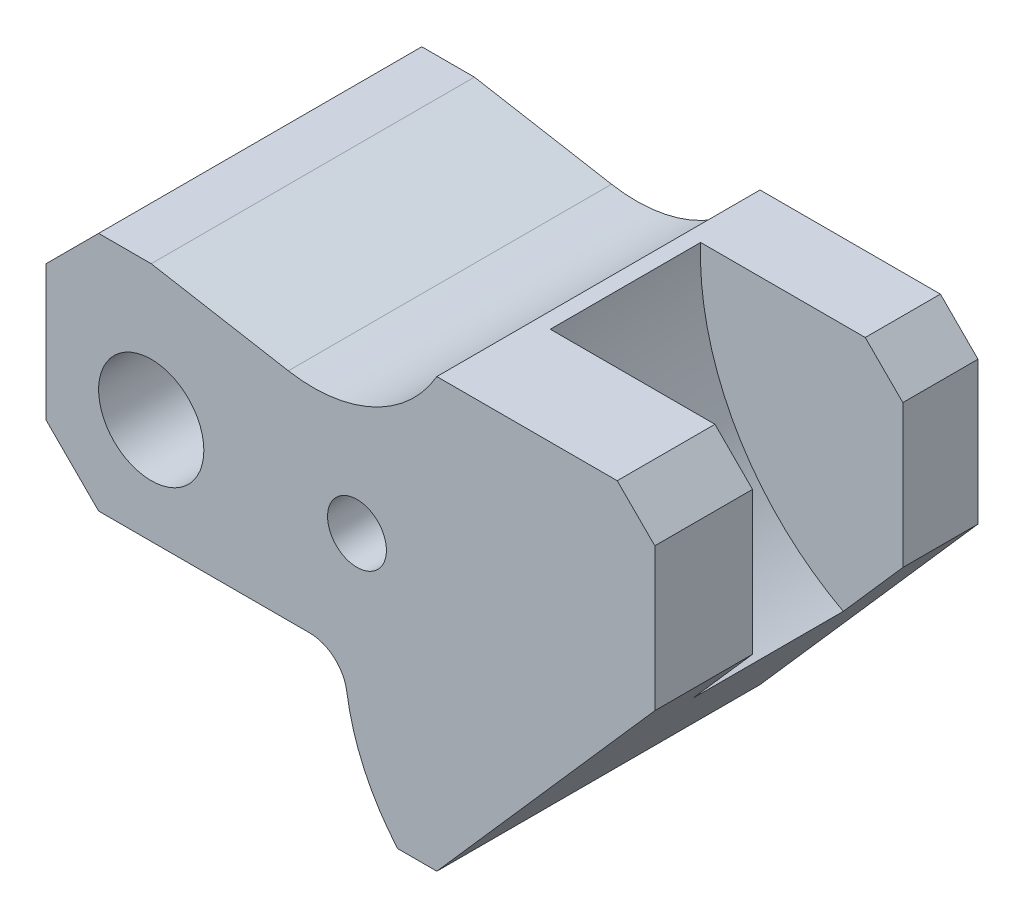
ISO-10303-21;
HEADER;
FILE_DESCRIPTION(('STEP AP214'),'2;1');
FILE_NAME('part.step','',(''),(''),'','','');
FILE_SCHEMA(('AUTOMOTIVE_DESIGN { 1 0 10303 214 1 1 1 1 }'));
ENDSEC;
DATA;
#1=APPLICATION_CONTEXT('core data for automotive mechanical design processes');
#2=APPLICATION_PROTOCOL_DEFINITION('international standard','automotive_design',2000,#1);
#3=PRODUCT_CONTEXT('',#1,'mechanical');
#4=PRODUCT('Part','Part','',(#3));
#5=PRODUCT_RELATED_PRODUCT_CATEGORY('part','',(#4));
#6=PRODUCT_DEFINITION_FORMATION('','',#4);
#7=PRODUCT_DEFINITION_CONTEXT('part definition',#1,'design');
#8=PRODUCT_DEFINITION('design','',#6,#7);
#9=PRODUCT_DEFINITION_SHAPE('','',#8);
#10=(LENGTH_UNIT() NAMED_UNIT(*) SI_UNIT(.MILLI.,.METRE.));
#11=(NAMED_UNIT(*) PLANE_ANGLE_UNIT() SI_UNIT($,.RADIAN.));
#12=(NAMED_UNIT(*) SI_UNIT($,.STERADIAN.) SOLID_ANGLE_UNIT());
#13=UNCERTAINTY_MEASURE_WITH_UNIT(LENGTH_MEASURE(1.E-05),#10,'distance_accuracy_value','');
#14=(GEOMETRIC_REPRESENTATION_CONTEXT(3) GLOBAL_UNCERTAINTY_ASSIGNED_CONTEXT((#13)) GLOBAL_UNIT_ASSIGNED_CONTEXT((#10,
#11,#12)) REPRESENTATION_CONTEXT('',''));
#15=CARTESIAN_POINT('',(0.,0.,0.));
#16=DIRECTION('',(0.,0.,1.));
#17=DIRECTION('',(1.,0.,0.));
#18=AXIS2_PLACEMENT_3D('',#15,#16,#17);
#19=CARTESIAN_POINT('',(67.,0.,43.));
#20=DIRECTION('',(-0.751164898449876,0.660114607728679,0.));
#21=DIRECTION('',(-0.660114607728679,-0.751164898449876,0.));
#22=AXIS2_PLACEMENT_3D('',#19,#20,#21);
#23=PLANE('',#22);
#24=DIRECTION('',(-0.660114607728679,-0.751164898449876,0.));
#25=VECTOR('',#24,1.);
#26=CARTESIAN_POINT('',(67.,0.,30.));
#27=LINE('',#26,#25);
#28=CARTESIAN_POINT('',(67.,0.,30.));
#29=VERTEX_POINT('',#28);
#30=CARTESIAN_POINT('',(59.0745424180986,-9.01862414492232,30.));
#31=VERTEX_POINT('',#30);
#32=EDGE_CURVE('E281',#29,#31,#27,.T.);
#33=ORIENTED_EDGE('',*,*,#32,.F.);
#34=DIRECTION('',(0.,0.,-1.));
#35=VECTOR('',#34,1.);
#36=CARTESIAN_POINT('',(67.,0.,43.));
#37=LINE('',#36,#35);
#38=CARTESIAN_POINT('',(67.,0.,43.));
#39=VERTEX_POINT('',#38);
#40=EDGE_CURVE('E232',#39,#29,#37,.T.);
#41=ORIENTED_EDGE('',*,*,#40,.F.);
#42=DIRECTION('',(0.660114607728679,0.751164898449876,0.));
#43=VECTOR('',#42,1.);
#44=CARTESIAN_POINT('',(67.,0.,43.));
#45=LINE('',#44,#43);
#46=CARTESIAN_POINT('',(38.,-33.,43.));
#47=VERTEX_POINT('',#46);
#48=EDGE_CURVE('E315',#47,#39,#45,.T.);
#49=ORIENTED_EDGE('',*,*,#48,.F.);
#50=DIRECTION('',(0.,0.,-1.));
#51=VECTOR('',#50,1.);
#52=CARTESIAN_POINT('',(38.,-33.,43.));
#53=LINE('',#52,#51);
#54=CARTESIAN_POINT('',(38.,-33.,0.));
#55=VERTEX_POINT('',#54);
#56=EDGE_CURVE('E235',#47,#55,#53,.T.);
#57=ORIENTED_EDGE('',*,*,#56,.T.);
#58=DIRECTION('',(0.660114607728679,0.751164898449876,0.));
#59=VECTOR('',#58,1.);
#60=CARTESIAN_POINT('',(67.,0.,0.));
#61=LINE('',#60,#59);
#62=CARTESIAN_POINT('',(67.,0.,0.));
#63=VERTEX_POINT('',#62);
#64=EDGE_CURVE('E194',#55,#63,#61,.T.);
#65=ORIENTED_EDGE('',*,*,#64,.T.);
#66=CARTESIAN_POINT('',(67.,0.,10.));
#67=VERTEX_POINT('',#66);
#68=EDGE_CURVE('E231',#67,#63,#37,.T.);
#69=ORIENTED_EDGE('',*,*,#68,.F.);
#70=DIRECTION('',(-0.660114607728679,-0.751164898449876,0.));
#71=VECTOR('',#70,1.);
#72=CARTESIAN_POINT('',(67.,0.,10.));
#73=LINE('',#72,#71);
#74=CARTESIAN_POINT('',(59.0745424180986,-9.01862414492232,10.));
#75=VERTEX_POINT('',#74);
#76=EDGE_CURVE('E292',#67,#75,#73,.T.);
#77=ORIENTED_EDGE('',*,*,#76,.T.);
#78=DIRECTION('',(0.,0.,-1.));
#79=VECTOR('',#78,1.);
#80=CARTESIAN_POINT('',(59.0745424180986,-9.01862414492231,30.));
#81=LINE('',#80,#79);
#82=EDGE_CURVE('E300',#75,#31,#81,.F.);
#83=ORIENTED_EDGE('',*,*,#82,.T.);
#84=EDGE_LOOP('',(#33,#41,#49,#57,#65,#69,#77,#83));
#85=FACE_BOUND('',#84,.T.);
#86=ADVANCED_FACE('F36',(#85),#23,.F.);
#87=CARTESIAN_POINT('',(67.,19.,43.));
#88=DIRECTION('',(-1.,0.,0.));
#89=DIRECTION('',(0.,0.,1.));
#90=AXIS2_PLACEMENT_3D('',#87,#88,#89);
#91=PLANE('',#90);
#92=DIRECTION('',(0.,-1.,0.));
#93=VECTOR('',#92,1.);
#94=CARTESIAN_POINT('',(67.,19.,30.));
#95=LINE('',#94,#93);
#96=CARTESIAN_POINT('',(67.,19.,30.));
#97=VERTEX_POINT('',#96);
#98=EDGE_CURVE('E297',#97,#29,#95,.T.);
#99=ORIENTED_EDGE('',*,*,#98,.F.);
#100=DIRECTION('',(0.,0.,-1.));
#101=VECTOR('',#100,1.);
#102=CARTESIAN_POINT('',(67.,19.,43.));
#103=LINE('',#102,#101);
#104=CARTESIAN_POINT('',(67.,19.,43.));
#105=VERTEX_POINT('',#104);
#106=EDGE_CURVE('E228',#105,#97,#103,.T.);
#107=ORIENTED_EDGE('',*,*,#106,.F.);
#108=DIRECTION('',(0.,1.,0.));
#109=VECTOR('',#108,1.);
#110=CARTESIAN_POINT('',(67.,19.,43.));
#111=LINE('',#110,#109);
#112=EDGE_CURVE('E317',#39,#105,#111,.T.);
#113=ORIENTED_EDGE('',*,*,#112,.F.);
#114=ORIENTED_EDGE('',*,*,#40,.T.);
#115=EDGE_LOOP('',(#99,#107,#113,#114));
#116=FACE_BOUND('',#115,.T.);
#117=ADVANCED_FACE('F366',(#116),#91,.F.);
#118=CARTESIAN_POINT('',(62.,24.,43.));
#119=DIRECTION('',(-0.707106781186548,-0.707106781186547,0.));
#120=DIRECTION('',(0.707106781186547,-0.707106781186548,0.));
#121=AXIS2_PLACEMENT_3D('',#118,#119,#120);
#122=PLANE('',#121);
#123=DIRECTION('',(0.707106781186547,-0.707106781186548,0.));
#124=VECTOR('',#123,1.);
#125=CARTESIAN_POINT('',(62.,24.,30.));
#126=LINE('',#125,#124);
#127=CARTESIAN_POINT('',(62.,24.,30.));
#128=VERTEX_POINT('',#127);
#129=EDGE_CURVE('E295',#128,#97,#126,.T.);
#130=ORIENTED_EDGE('',*,*,#129,.F.);
#131=DIRECTION('',(0.,0.,-1.));
#132=VECTOR('',#131,1.);
#133=CARTESIAN_POINT('',(62.,24.,43.));
#134=LINE('',#133,#132);
#135=CARTESIAN_POINT('',(62.,24.,43.));
#136=VERTEX_POINT('',#135);
#137=EDGE_CURVE('E224',#136,#128,#134,.T.);
#138=ORIENTED_EDGE('',*,*,#137,.F.);
#139=DIRECTION('',(-0.707106781186547,0.707106781186548,0.));
#140=VECTOR('',#139,1.);
#141=CARTESIAN_POINT('',(62.,24.,43.));
#142=LINE('',#141,#140);
#143=EDGE_CURVE('E319',#105,#136,#142,.T.);
#144=ORIENTED_EDGE('',*,*,#143,.F.);
#145=ORIENTED_EDGE('',*,*,#106,.T.);
#146=EDGE_LOOP('',(#130,#138,#144,#145));
#147=FACE_BOUND('',#146,.T.);
#148=ADVANCED_FACE('F370',(#147),#122,.F.);
#149=CARTESIAN_POINT('',(38.,24.,43.));
#150=DIRECTION('',(0.,-1.,0.));
#151=DIRECTION('',(0.,0.,-1.));
#152=AXIS2_PLACEMENT_3D('',#149,#150,#151);
#153=PLANE('',#152);
#154=DIRECTION('',(1.,0.,0.));
#155=VECTOR('',#154,1.);
#156=CARTESIAN_POINT('',(38.,24.,30.));
#157=LINE('',#156,#155);
#158=CARTESIAN_POINT('',(40.0958327134396,24.,30.));
#159=VERTEX_POINT('',#158);
#160=EDGE_CURVE('E12',#159,#128,#157,.T.);
#161=ORIENTED_EDGE('',*,*,#160,.F.);
#162=DIRECTION('',(0.,0.,-1.));
#163=VECTOR('',#162,1.);
#164=CARTESIAN_POINT('',(40.0958327134396,24.,30.));
#165=LINE('',#164,#163);
#166=CARTESIAN_POINT('',(40.0958327134396,24.,10.));
#167=VERTEX_POINT('',#166);
#168=EDGE_CURVE('E44',#159,#167,#165,.T.);
#169=ORIENTED_EDGE('',*,*,#168,.T.);
#170=DIRECTION('',(1.,0.,0.));
#171=VECTOR('',#170,1.);
#172=CARTESIAN_POINT('',(38.,24.,10.));
#173=LINE('',#172,#171);
#174=CARTESIAN_POINT('',(62.,24.,10.));
#175=VERTEX_POINT('',#174);
#176=EDGE_CURVE('E249',#167,#175,#173,.T.);
#177=ORIENTED_EDGE('',*,*,#176,.T.);
#178=CARTESIAN_POINT('',(62.,24.,0.));
#179=VERTEX_POINT('',#178);
#180=EDGE_CURVE('E223',#175,#179,#134,.T.);
#181=ORIENTED_EDGE('',*,*,#180,.T.);
#182=DIRECTION('',(-1.,0.,0.));
#183=VECTOR('',#182,1.);
#184=CARTESIAN_POINT('',(38.,24.,0.));
#185=LINE('',#184,#183);
#186=CARTESIAN_POINT('',(38.,24.,0.));
#187=VERTEX_POINT('',#186);
#188=EDGE_CURVE('E203',#179,#187,#185,.T.);
#189=ORIENTED_EDGE('',*,*,#188,.T.);
#190=DIRECTION('',(0.,0.,-1.));
#191=VECTOR('',#190,1.);
#192=CARTESIAN_POINT('',(38.,24.,43.));
#193=LINE('',#192,#191);
#194=CARTESIAN_POINT('',(38.,24.,43.));
#195=VERTEX_POINT('',#194);
#196=EDGE_CURVE('E220',#195,#187,#193,.T.);
#197=ORIENTED_EDGE('',*,*,#196,.F.);
#198=DIRECTION('',(-1.,0.,0.));
#199=VECTOR('',#198,1.);
#200=CARTESIAN_POINT('',(38.,24.,43.));
#201=LINE('',#200,#199);
#202=EDGE_CURVE('E321',#136,#195,#201,.T.);
#203=ORIENTED_EDGE('',*,*,#202,.F.);
#204=ORIENTED_EDGE('',*,*,#137,.T.);
#205=EDGE_LOOP('',(#161,#169,#177,#181,#189,#197,#203,#204));
#206=FACE_BOUND('',#205,.T.);
#207=ADVANCED_FACE('F255',(#206),#153,.F.);
#208=CARTESIAN_POINT('',(21.0666262553692,-19.,43.));
#209=DIRECTION('',(0.,0.,-1.));
#210=DIRECTION('',(-1.,0.,0.));
#211=AXIS2_PLACEMENT_3D('',#208,#209,#210);
#212=PLANE('',#211);
#213=CARTESIAN_POINT('',(27.3749329548053,0.618357785610859,43.));
#214=DIRECTION('',(0.,0.,1.));
#215=DIRECTION('',(1.,0.,0.));
#216=AXIS2_PLACEMENT_3D('',#213,#214,#215);
#217=CIRCLE('',#216,3.91770709623054);
#218=CARTESIAN_POINT('',(31.2926400510358,0.618357785610859,43.));
#219=VERTEX_POINT('',#218);
#220=EDGE_CURVE('E485',#219,#219,#217,.T.);
#221=ORIENTED_EDGE('',*,*,#220,.F.);
#222=EDGE_LOOP('',(#221));
#223=FACE_BOUND('',#222,.T.);
#224=DIRECTION('',(0.707106781186544,-0.707106781186551,0.));
#225=VECTOR('',#224,1.);
#226=CARTESIAN_POINT('',(-14.,-7.,43.));
#227=LINE('',#226,#225);
#228=CARTESIAN_POINT('',(-14.,-7.,43.));
#229=VERTEX_POINT('',#228);
#230=CARTESIAN_POINT('',(-7.00000000000007,-14.,43.));
#231=VERTEX_POINT('',#230);
#232=EDGE_CURVE('E213',#229,#231,#227,.T.);
#233=ORIENTED_EDGE('',*,*,#232,.T.);
#234=DIRECTION('',(1.,0.,0.));
#235=VECTOR('',#234,1.);
#236=CARTESIAN_POINT('',(-7.00000000000007,-14.,43.));
#237=LINE('',#236,#235);
#238=CARTESIAN_POINT('',(21.0666262553692,-14.,43.));
#239=VERTEX_POINT('',#238);
#240=EDGE_CURVE('E120',#231,#239,#237,.T.);
#241=ORIENTED_EDGE('',*,*,#240,.T.);
#242=CARTESIAN_POINT('',(21.0666262553692,-19.,43.));
#243=DIRECTION('',(0.,0.,-1.));
#244=DIRECTION('',(-1.,0.,0.));
#245=AXIS2_PLACEMENT_3D('',#242,#243,#244);
#246=CIRCLE('',#245,5.);
#247=CARTESIAN_POINT('',(26.0122649967811,-18.2647058823529,43.));
#248=VERTEX_POINT('',#247);
#249=EDGE_CURVE('E309',#239,#248,#246,.T.);
#250=ORIENTED_EDGE('',*,*,#249,.T.);
#251=CARTESIAN_POINT('',(54.6969696969697,-14.,43.));
#252=DIRECTION('',(0.,0.,1.));
#253=DIRECTION('',(1.,0.,0.));
#254=AXIS2_PLACEMENT_3D('',#251,#252,#253);
#255=CIRCLE('',#254,29.);
#256=CARTESIAN_POINT('',(32.7880673967631,-33.,43.));
#257=VERTEX_POINT('',#256);
#258=EDGE_CURVE('E311',#248,#257,#255,.T.);
#259=ORIENTED_EDGE('',*,*,#258,.T.);
#260=DIRECTION('',(1.,0.,0.));
#261=VECTOR('',#260,1.);
#262=CARTESIAN_POINT('',(38.,-33.,43.));
#263=LINE('',#262,#261);
#264=EDGE_CURVE('E313',#257,#47,#263,.T.);
#265=ORIENTED_EDGE('',*,*,#264,.T.);
#266=ORIENTED_EDGE('',*,*,#48,.T.);
#267=ORIENTED_EDGE('',*,*,#112,.T.);
#268=ORIENTED_EDGE('',*,*,#143,.T.);
#269=ORIENTED_EDGE('',*,*,#202,.T.);
#270=CARTESIAN_POINT('',(21.5424003635473,33.4945992125119,43.));
#271=DIRECTION('',(0.,0.,-1.));
#272=DIRECTION('',(1.,0.,0.));
#273=AXIS2_PLACEMENT_3D('',#270,#271,#272);
#274=CIRCLE('',#273,19.);
#275=CARTESIAN_POINT('',(18.2430849878756,14.78325190528,43.));
#276=VERTEX_POINT('',#275);
#277=EDGE_CURVE('E323',#195,#276,#274,.T.);
#278=ORIENTED_EDGE('',*,*,#277,.T.);
#279=DIRECTION('',(-0.984807753012208,0.173648177666931,0.));
#280=VECTOR('',#279,1.);
#281=CARTESIAN_POINT('',(0.,18.,43.));
#282=LINE('',#281,#280);
#283=CARTESIAN_POINT('',(0.,18.,43.));
#284=VERTEX_POINT('',#283);
#285=EDGE_CURVE('E161',#276,#284,#282,.T.);
#286=ORIENTED_EDGE('',*,*,#285,.T.);
#287=DIRECTION('',(-1.,0.,0.));
#288=VECTOR('',#287,1.);
#289=CARTESIAN_POINT('',(-6.99999999999998,18.,43.));
#290=LINE('',#289,#288);
#291=CARTESIAN_POINT('',(-6.99999999999998,18.,43.));
#292=VERTEX_POINT('',#291);
#293=EDGE_CURVE('E153',#284,#292,#290,.T.);
#294=ORIENTED_EDGE('',*,*,#293,.T.);
#295=DIRECTION('',(-0.707106781186549,-0.707106781186546,0.));
#296=VECTOR('',#295,1.);
#297=CARTESIAN_POINT('',(-14.,11.,43.));
#298=LINE('',#297,#296);
#299=CARTESIAN_POINT('',(-14.,11.,43.));
#300=VERTEX_POINT('',#299);
#301=EDGE_CURVE('E158',#292,#300,#298,.T.);
#302=ORIENTED_EDGE('',*,*,#301,.T.);
#303=DIRECTION('',(0.,-1.,0.));
#304=VECTOR('',#303,1.);
#305=CARTESIAN_POINT('',(-14.,-7.,43.));
#306=LINE('',#305,#304);
#307=EDGE_CURVE('E60',#300,#229,#306,.T.);
#308=ORIENTED_EDGE('',*,*,#307,.T.);
#309=EDGE_LOOP('',(#233,#241,#250,#259,#265,#266,#267,#268,#269,#278,#286,#294,#302,#308));
#310=FACE_BOUND('',#309,.T.);
#311=CARTESIAN_POINT('',(0.,0.,43.));
#312=DIRECTION('',(0.,0.,1.));
#313=DIRECTION('',(1.,0.,0.));
#314=AXIS2_PLACEMENT_3D('',#311,#312,#313);
#315=CIRCLE('',#314,7.);
#316=CARTESIAN_POINT('',(7.,0.,43.));
#317=VERTEX_POINT('',#316);
#318=EDGE_CURVE('E186',#317,#317,#315,.T.);
#319=ORIENTED_EDGE('',*,*,#318,.F.);
#320=EDGE_LOOP('',(#319));
#321=FACE_BOUND('',#320,.T.);
#322=ADVANCED_FACE('F155',(#223,#310,#321),#212,.F.);
#323=CARTESIAN_POINT('',(21.0666262553692,-19.,0.));
#324=DIRECTION('',(0.,0.,-1.));
#325=DIRECTION('',(-1.,0.,0.));
#326=AXIS2_PLACEMENT_3D('',#323,#324,#325);
#327=PLANE('',#326);
#328=DIRECTION('',(0.707106781186544,-0.707106781186551,0.));
#329=VECTOR('',#328,1.);
#330=CARTESIAN_POINT('',(-14.,-7.,0.));
#331=LINE('',#330,#329);
#332=CARTESIAN_POINT('',(-14.,-7.,0.));
#333=VERTEX_POINT('',#332);
#334=CARTESIAN_POINT('',(-7.00000000000007,-14.,0.));
#335=VERTEX_POINT('',#334);
#336=EDGE_CURVE('E182',#333,#335,#331,.T.);
#337=ORIENTED_EDGE('',*,*,#336,.F.);
#338=DIRECTION('',(0.,-1.,0.));
#339=VECTOR('',#338,1.);
#340=CARTESIAN_POINT('',(-14.,-7.,0.));
#341=LINE('',#340,#339);
#342=CARTESIAN_POINT('',(-14.,11.,0.));
#343=VERTEX_POINT('',#342);
#344=EDGE_CURVE('E111',#343,#333,#341,.T.);
#345=ORIENTED_EDGE('',*,*,#344,.F.);
#346=DIRECTION('',(-0.707106781186549,-0.707106781186546,0.));
#347=VECTOR('',#346,1.);
#348=CARTESIAN_POINT('',(-14.,11.,0.));
#349=LINE('',#348,#347);
#350=CARTESIAN_POINT('',(-6.99999999999998,18.,0.));
#351=VERTEX_POINT('',#350);
#352=EDGE_CURVE('E210',#351,#343,#349,.T.);
#353=ORIENTED_EDGE('',*,*,#352,.F.);
#354=DIRECTION('',(-1.,0.,0.));
#355=VECTOR('',#354,1.);
#356=CARTESIAN_POINT('',(-6.99999999999998,18.,0.));
#357=LINE('',#356,#355);
#358=CARTESIAN_POINT('',(0.,18.,0.));
#359=VERTEX_POINT('',#358);
#360=EDGE_CURVE('E170',#359,#351,#357,.T.);
#361=ORIENTED_EDGE('',*,*,#360,.F.);
#362=DIRECTION('',(-0.984807753012208,0.173648177666931,0.));
#363=VECTOR('',#362,1.);
#364=CARTESIAN_POINT('',(0.,18.,0.));
#365=LINE('',#364,#363);
#366=CARTESIAN_POINT('',(18.2430849878756,14.78325190528,0.));
#367=VERTEX_POINT('',#366);
#368=EDGE_CURVE('E207',#367,#359,#365,.T.);
#369=ORIENTED_EDGE('',*,*,#368,.F.);
#370=CARTESIAN_POINT('',(21.5424003635473,33.4945992125119,0.));
#371=DIRECTION('',(0.,0.,-1.));
#372=DIRECTION('',(1.,0.,0.));
#373=AXIS2_PLACEMENT_3D('',#370,#371,#372);
#374=CIRCLE('',#373,19.);
#375=EDGE_CURVE('E205',#187,#367,#374,.T.);
#376=ORIENTED_EDGE('',*,*,#375,.F.);
#377=ORIENTED_EDGE('',*,*,#188,.F.);
#378=DIRECTION('',(-0.707106781186547,0.707106781186548,0.));
#379=VECTOR('',#378,1.);
#380=CARTESIAN_POINT('',(62.,24.,0.));
#381=LINE('',#380,#379);
#382=CARTESIAN_POINT('',(67.,19.,0.));
#383=VERTEX_POINT('',#382);
#384=EDGE_CURVE('E200',#383,#179,#381,.T.);
#385=ORIENTED_EDGE('',*,*,#384,.F.);
#386=DIRECTION('',(0.,1.,0.));
#387=VECTOR('',#386,1.);
#388=CARTESIAN_POINT('',(67.,19.,0.));
#389=LINE('',#388,#387);
#390=EDGE_CURVE('E197',#63,#383,#389,.T.);
#391=ORIENTED_EDGE('',*,*,#390,.F.);
#392=ORIENTED_EDGE('',*,*,#64,.F.);
#393=DIRECTION('',(1.,0.,0.));
#394=VECTOR('',#393,1.);
#395=CARTESIAN_POINT('',(38.,-33.,0.));
#396=LINE('',#395,#394);
#397=CARTESIAN_POINT('',(32.7880673967631,-33.,0.));
#398=VERTEX_POINT('',#397);
#399=EDGE_CURVE('E192',#398,#55,#396,.T.);
#400=ORIENTED_EDGE('',*,*,#399,.F.);
#401=CARTESIAN_POINT('',(54.6969696969697,-14.,0.));
#402=DIRECTION('',(0.,0.,1.));
#403=DIRECTION('',(1.,0.,0.));
#404=AXIS2_PLACEMENT_3D('',#401,#402,#403);
#405=CIRCLE('',#404,29.);
#406=CARTESIAN_POINT('',(26.0122649967811,-18.2647058823529,0.));
#407=VERTEX_POINT('',#406);
#408=EDGE_CURVE('E190',#407,#398,#405,.T.);
#409=ORIENTED_EDGE('',*,*,#408,.F.);
#410=CARTESIAN_POINT('',(21.0666262553692,-19.,0.));
#411=DIRECTION('',(0.,0.,-1.));
#412=DIRECTION('',(-1.,0.,0.));
#413=AXIS2_PLACEMENT_3D('',#410,#411,#412);
#414=CIRCLE('',#413,5.);
#415=CARTESIAN_POINT('',(21.0666262553692,-14.,0.));
#416=VERTEX_POINT('',#415);
#417=EDGE_CURVE('E188',#416,#407,#414,.T.);
#418=ORIENTED_EDGE('',*,*,#417,.F.);
#419=DIRECTION('',(1.,0.,0.));
#420=VECTOR('',#419,1.);
#421=CARTESIAN_POINT('',(-7.00000000000007,-14.,0.));
#422=LINE('',#421,#420);
#423=EDGE_CURVE('E185',#335,#416,#422,.T.);
#424=ORIENTED_EDGE('',*,*,#423,.F.);
#425=EDGE_LOOP('',(#337,#345,#353,#361,#369,#376,#377,#385,#391,#392,#400,#409,#418,#424));
#426=FACE_BOUND('',#425,.T.);
#427=CARTESIAN_POINT('',(0.,0.,0.));
#428=DIRECTION('',(0.,0.,1.));
#429=DIRECTION('',(1.,0.,0.));
#430=AXIS2_PLACEMENT_3D('',#427,#428,#429);
#431=CIRCLE('',#430,7.);
#432=CARTESIAN_POINT('',(7.,0.,0.));
#433=VERTEX_POINT('',#432);
#434=EDGE_CURVE('E302',#433,#433,#431,.T.);
#435=ORIENTED_EDGE('',*,*,#434,.T.);
#436=EDGE_LOOP('',(#435));
#437=FACE_BOUND('',#436,.T.);
#438=ADVANCED_FACE('F336',(#426,#437),#327,.T.);
#439=CARTESIAN_POINT('',(-14.,-7.,43.));
#440=DIRECTION('',(0.707106781186551,0.707106781186544,0.));
#441=DIRECTION('',(-0.707106781186544,0.707106781186551,0.));
#442=AXIS2_PLACEMENT_3D('',#439,#440,#441);
#443=PLANE('',#442);
#444=ORIENTED_EDGE('',*,*,#336,.T.);
#445=DIRECTION('',(0.,0.,-1.));
#446=VECTOR('',#445,1.);
#447=CARTESIAN_POINT('',(-7.00000000000007,-14.,43.));
#448=LINE('',#447,#446);
#449=EDGE_CURVE('E247',#231,#335,#448,.T.);
#450=ORIENTED_EDGE('',*,*,#449,.F.);
#451=ORIENTED_EDGE('',*,*,#232,.F.);
#452=DIRECTION('',(0.,0.,-1.));
#453=VECTOR('',#452,1.);
#454=CARTESIAN_POINT('',(-14.,-7.,43.));
#455=LINE('',#454,#453);
#456=EDGE_CURVE('E178',#229,#333,#455,.T.);
#457=ORIENTED_EDGE('',*,*,#456,.T.);
#458=EDGE_LOOP('',(#444,#450,#451,#457));
#459=FACE_BOUND('',#458,.T.);
#460=ADVANCED_FACE('F38',(#459),#443,.F.);
#461=CARTESIAN_POINT('',(-7.00000000000007,-14.,43.));
#462=DIRECTION('',(0.,1.,0.));
#463=DIRECTION('',(0.,0.,1.));
#464=AXIS2_PLACEMENT_3D('',#461,#462,#463);
#465=PLANE('',#464);
#466=ORIENTED_EDGE('',*,*,#423,.T.);
#467=DIRECTION('',(0.,0.,-1.));
#468=VECTOR('',#467,1.);
#469=CARTESIAN_POINT('',(21.0666262553692,-14.,43.));
#470=LINE('',#469,#468);
#471=EDGE_CURVE('E244',#239,#416,#470,.T.);
#472=ORIENTED_EDGE('',*,*,#471,.F.);
#473=ORIENTED_EDGE('',*,*,#240,.F.);
#474=ORIENTED_EDGE('',*,*,#449,.T.);
#475=EDGE_LOOP('',(#466,#472,#473,#474));
#476=FACE_BOUND('',#475,.T.);
#477=ADVANCED_FACE('F344',(#476),#465,.F.);
#478=CARTESIAN_POINT('',(21.0666262553692,-19.,43.));
#479=DIRECTION('',(0.,0.,-1.));
#480=DIRECTION('',(-1.,0.,0.));
#481=AXIS2_PLACEMENT_3D('',#478,#479,#480);
#482=CYLINDRICAL_SURFACE('',#481,5.);
#483=ORIENTED_EDGE('',*,*,#417,.T.);
#484=DIRECTION('',(0.,0.,-1.));
#485=VECTOR('',#484,1.);
#486=CARTESIAN_POINT('',(26.0122649967811,-18.2647058823529,43.));
#487=LINE('',#486,#485);
#488=EDGE_CURVE('E241',#248,#407,#487,.T.);
#489=ORIENTED_EDGE('',*,*,#488,.F.);
#490=ORIENTED_EDGE('',*,*,#249,.F.);
#491=ORIENTED_EDGE('',*,*,#471,.T.);
#492=EDGE_LOOP('',(#483,#489,#490,#491));
#493=FACE_BOUND('',#492,.T.);
#494=ADVANCED_FACE('F347',(#493),#482,.F.);
#495=CARTESIAN_POINT('',(54.6969696969697,-14.,43.));
#496=DIRECTION('',(0.,0.,-1.));
#497=DIRECTION('',(-1.,0.,0.));
#498=AXIS2_PLACEMENT_3D('',#495,#496,#497);
#499=CYLINDRICAL_SURFACE('',#498,29.);
#500=ORIENTED_EDGE('',*,*,#408,.T.);
#501=DIRECTION('',(0.,0.,-1.));
#502=VECTOR('',#501,1.);
#503=CARTESIAN_POINT('',(32.7880673967631,-33.,43.));
#504=LINE('',#503,#502);
#505=EDGE_CURVE('E238',#257,#398,#504,.T.);
#506=ORIENTED_EDGE('',*,*,#505,.F.);
#507=ORIENTED_EDGE('',*,*,#258,.F.);
#508=ORIENTED_EDGE('',*,*,#488,.T.);
#509=EDGE_LOOP('',(#500,#506,#507,#508));
#510=FACE_BOUND('',#509,.T.);
#511=ADVANCED_FACE('F352',(#510),#499,.T.);
#512=CARTESIAN_POINT('',(38.,-33.,43.));
#513=DIRECTION('',(0.,1.,0.));
#514=DIRECTION('',(0.,0.,1.));
#515=AXIS2_PLACEMENT_3D('',#512,#513,#514);
#516=PLANE('',#515);
#517=ORIENTED_EDGE('',*,*,#399,.T.);
#518=ORIENTED_EDGE('',*,*,#56,.F.);
#519=ORIENTED_EDGE('',*,*,#264,.F.);
#520=ORIENTED_EDGE('',*,*,#505,.T.);
#521=EDGE_LOOP('',(#517,#518,#519,#520));
#522=FACE_BOUND('',#521,.T.);
#523=ADVANCED_FACE('F358',(#522),#516,.F.);
#524=CARTESIAN_POINT('',(67.,19.,10.));
#525=VERTEX_POINT('',#524);
#526=EDGE_CURVE('E227',#525,#383,#103,.T.);
#527=ORIENTED_EDGE('',*,*,#526,.F.);
#528=DIRECTION('',(0.,-1.,0.));
#529=VECTOR('',#528,1.);
#530=CARTESIAN_POINT('',(67.,19.,10.));
#531=LINE('',#530,#529);
#532=EDGE_CURVE('E283',#525,#67,#531,.T.);
#533=ORIENTED_EDGE('',*,*,#532,.T.);
#534=ORIENTED_EDGE('',*,*,#68,.T.);
#535=ORIENTED_EDGE('',*,*,#390,.T.);
#536=EDGE_LOOP('',(#527,#533,#534,#535));
#537=FACE_BOUND('',#536,.T.);
#538=ADVANCED_FACE('F379',(#537),#91,.F.);
#539=ORIENTED_EDGE('',*,*,#180,.F.);
#540=DIRECTION('',(0.707106781186547,-0.707106781186548,0.));
#541=VECTOR('',#540,1.);
#542=CARTESIAN_POINT('',(62.,24.,10.));
#543=LINE('',#542,#541);
#544=EDGE_CURVE('E51',#175,#525,#543,.T.);
#545=ORIENTED_EDGE('',*,*,#544,.T.);
#546=ORIENTED_EDGE('',*,*,#526,.T.);
#547=ORIENTED_EDGE('',*,*,#384,.T.);
#548=EDGE_LOOP('',(#539,#545,#546,#547));
#549=FACE_BOUND('',#548,.T.);
#550=ADVANCED_FACE('F375',(#549),#122,.F.);
#551=CARTESIAN_POINT('',(21.5424003635473,33.4945992125119,43.));
#552=DIRECTION('',(0.,0.,-1.));
#553=DIRECTION('',(-1.,0.,0.));
#554=AXIS2_PLACEMENT_3D('',#551,#552,#553);
#555=CYLINDRICAL_SURFACE('',#554,19.);
#556=ORIENTED_EDGE('',*,*,#375,.T.);
#557=DIRECTION('',(0.,0.,-1.));
#558=VECTOR('',#557,1.);
#559=CARTESIAN_POINT('',(18.2430849878756,14.78325190528,43.));
#560=LINE('',#559,#558);
#561=EDGE_CURVE('E217',#276,#367,#560,.T.);
#562=ORIENTED_EDGE('',*,*,#561,.F.);
#563=ORIENTED_EDGE('',*,*,#277,.F.);
#564=ORIENTED_EDGE('',*,*,#196,.T.);
#565=EDGE_LOOP('',(#556,#562,#563,#564));
#566=FACE_BOUND('',#565,.T.);
#567=ADVANCED_FACE('F329',(#566),#555,.F.);
#568=CARTESIAN_POINT('',(0.,18.,43.));
#569=DIRECTION('',(-0.173648177666931,-0.984807753012208,0.));
#570=DIRECTION('',(0.984807753012208,-0.173648177666931,0.));
#571=AXIS2_PLACEMENT_3D('',#568,#569,#570);
#572=PLANE('',#571);
#573=ORIENTED_EDGE('',*,*,#368,.T.);
#574=DIRECTION('',(0.,0.,-1.));
#575=VECTOR('',#574,1.);
#576=CARTESIAN_POINT('',(0.,18.,43.));
#577=LINE('',#576,#575);
#578=EDGE_CURVE('E173',#284,#359,#577,.T.);
#579=ORIENTED_EDGE('',*,*,#578,.F.);
#580=ORIENTED_EDGE('',*,*,#285,.F.);
#581=ORIENTED_EDGE('',*,*,#561,.T.);
#582=EDGE_LOOP('',(#573,#579,#580,#581));
#583=FACE_BOUND('',#582,.T.);
#584=ADVANCED_FACE('F333',(#583),#572,.F.);
#585=CARTESIAN_POINT('',(-6.99999999999998,18.,43.));
#586=DIRECTION('',(0.,-1.,0.));
#587=DIRECTION('',(0.,0.,-1.));
#588=AXIS2_PLACEMENT_3D('',#585,#586,#587);
#589=PLANE('',#588);
#590=ORIENTED_EDGE('',*,*,#360,.T.);
#591=DIRECTION('',(0.,0.,-1.));
#592=VECTOR('',#591,1.);
#593=CARTESIAN_POINT('',(-6.99999999999998,18.,43.));
#594=LINE('',#593,#592);
#595=EDGE_CURVE('E167',#292,#351,#594,.T.);
#596=ORIENTED_EDGE('',*,*,#595,.F.);
#597=ORIENTED_EDGE('',*,*,#293,.F.);
#598=ORIENTED_EDGE('',*,*,#578,.T.);
#599=EDGE_LOOP('',(#590,#596,#597,#598));
#600=FACE_BOUND('',#599,.T.);
#601=ADVANCED_FACE('F168',(#600),#589,.F.);
#602=CARTESIAN_POINT('',(-14.,11.,43.));
#603=DIRECTION('',(0.707106781186546,-0.707106781186549,0.));
#604=DIRECTION('',(0.707106781186549,0.707106781186546,0.));
#605=AXIS2_PLACEMENT_3D('',#602,#603,#604);
#606=PLANE('',#605);
#607=ORIENTED_EDGE('',*,*,#352,.T.);
#608=DIRECTION('',(0.,0.,-1.));
#609=VECTOR('',#608,1.);
#610=CARTESIAN_POINT('',(-14.,11.,43.));
#611=LINE('',#610,#609);
#612=EDGE_CURVE('E174',#300,#343,#611,.T.);
#613=ORIENTED_EDGE('',*,*,#612,.F.);
#614=ORIENTED_EDGE('',*,*,#301,.F.);
#615=ORIENTED_EDGE('',*,*,#595,.T.);
#616=EDGE_LOOP('',(#607,#613,#614,#615));
#617=FACE_BOUND('',#616,.T.);
#618=ADVANCED_FACE('F176',(#617),#606,.F.);
#619=CARTESIAN_POINT('',(-14.,-7.,43.));
#620=DIRECTION('',(1.,0.,0.));
#621=DIRECTION('',(0.,1.,0.));
#622=AXIS2_PLACEMENT_3D('',#619,#620,#621);
#623=PLANE('',#622);
#624=ORIENTED_EDGE('',*,*,#344,.T.);
#625=ORIENTED_EDGE('',*,*,#456,.F.);
#626=ORIENTED_EDGE('',*,*,#307,.F.);
#627=ORIENTED_EDGE('',*,*,#612,.T.);
#628=EDGE_LOOP('',(#624,#625,#626,#627));
#629=FACE_BOUND('',#628,.T.);
#630=ADVANCED_FACE('F338',(#629),#623,.F.);
#631=CARTESIAN_POINT('',(0.,0.,43.));
#632=DIRECTION('',(0.,0.,-1.));
#633=DIRECTION('',(-1.,0.,0.));
#634=AXIS2_PLACEMENT_3D('',#631,#632,#633);
#635=CYLINDRICAL_SURFACE('',#634,7.);
#636=ORIENTED_EDGE('',*,*,#318,.T.);
#637=EDGE_LOOP('',(#636));
#638=FACE_BOUND('',#637,.T.);
#639=ORIENTED_EDGE('',*,*,#434,.F.);
#640=EDGE_LOOP('',(#639));
#641=FACE_BOUND('',#640,.T.);
#642=ADVANCED_FACE('F431',(#638,#641),#635,.F.);
#643=CARTESIAN_POINT('',(75.9386115710435,22.6383204189674,30.));
#644=DIRECTION('',(0.,0.,-1.));
#645=DIRECTION('',(-1.,0.,0.));
#646=AXIS2_PLACEMENT_3D('',#643,#644,#645);
#647=CYLINDRICAL_SURFACE('',#646,35.8686348711028);
#648=CARTESIAN_POINT('',(75.9386115710435,22.6383204189674,10.));
#649=DIRECTION('',(0.,0.,-1.));
#650=DIRECTION('',(-1.,0.,0.));
#651=AXIS2_PLACEMENT_3D('',#648,#649,#650);
#652=CIRCLE('',#651,35.8686348711028);
#653=EDGE_CURVE('E270',#75,#167,#652,.T.);
#654=ORIENTED_EDGE('',*,*,#653,.T.);
#655=ORIENTED_EDGE('',*,*,#168,.F.);
#656=CARTESIAN_POINT('',(75.9386115710435,22.6383204189674,30.));
#657=DIRECTION('',(0.,0.,-1.));
#658=DIRECTION('',(-1.,0.,0.));
#659=AXIS2_PLACEMENT_3D('',#656,#657,#658);
#660=CIRCLE('',#659,35.8686348711028);
#661=EDGE_CURVE('E267',#31,#159,#660,.T.);
#662=ORIENTED_EDGE('',*,*,#661,.F.);
#663=ORIENTED_EDGE('',*,*,#82,.F.);
#664=EDGE_LOOP('',(#654,#655,#662,#663));
#665=FACE_BOUND('',#664,.T.);
#666=ADVANCED_FACE('F264',(#665),#647,.F.);
#667=CARTESIAN_POINT('',(75.9386115710435,22.6383204189674,30.));
#668=DIRECTION('',(0.,0.,-1.));
#669=DIRECTION('',(-1.,0.,0.));
#670=AXIS2_PLACEMENT_3D('',#667,#668,#669);
#671=PLANE('',#670);
#672=ORIENTED_EDGE('',*,*,#32,.T.);
#673=ORIENTED_EDGE('',*,*,#661,.T.);
#674=ORIENTED_EDGE('',*,*,#160,.T.);
#675=ORIENTED_EDGE('',*,*,#129,.T.);
#676=ORIENTED_EDGE('',*,*,#98,.T.);
#677=EDGE_LOOP('',(#672,#673,#674,#675,#676));
#678=FACE_BOUND('',#677,.T.);
#679=ADVANCED_FACE('F275',(#678),#671,.T.);
#680=CARTESIAN_POINT('',(75.9386115710435,22.6383204189674,10.));
#681=DIRECTION('',(0.,0.,-1.));
#682=DIRECTION('',(-1.,0.,0.));
#683=AXIS2_PLACEMENT_3D('',#680,#681,#682);
#684=PLANE('',#683);
#685=ORIENTED_EDGE('',*,*,#532,.F.);
#686=ORIENTED_EDGE('',*,*,#544,.F.);
#687=ORIENTED_EDGE('',*,*,#176,.F.);
#688=ORIENTED_EDGE('',*,*,#653,.F.);
#689=ORIENTED_EDGE('',*,*,#76,.F.);
#690=EDGE_LOOP('',(#685,#686,#687,#688,#689));
#691=FACE_BOUND('',#690,.T.);
#692=ADVANCED_FACE('F388',(#691),#684,.F.);
#693=CARTESIAN_POINT('',(21.0666262553692,-19.,20.));
#694=DIRECTION('',(0.,0.,-1.));
#695=DIRECTION('',(-1.,0.,0.));
#696=AXIS2_PLACEMENT_3D('',#693,#694,#695);
#697=PLANE('',#696);
#698=CARTESIAN_POINT('',(27.3749329548053,0.618357785610859,20.));
#699=DIRECTION('',(0.,0.,-1.));
#700=DIRECTION('',(-1.,0.,0.));
#701=AXIS2_PLACEMENT_3D('',#698,#699,#700);
#702=CIRCLE('',#701,3.91770709623054);
#703=CARTESIAN_POINT('',(31.2926400510358,0.618357785610859,20.));
#704=VERTEX_POINT('',#703);
#705=EDGE_CURVE('E285',#704,#704,#702,.F.);
#706=ORIENTED_EDGE('',*,*,#705,.T.);
#707=EDGE_LOOP('',(#706));
#708=FACE_BOUND('',#707,.T.);
#709=ADVANCED_FACE('F390',(#708),#697,.F.);
#710=CARTESIAN_POINT('',(27.3749329548053,0.618357785610859,-11.0809490177891));
#711=DIRECTION('',(0.,0.,1.));
#712=DIRECTION('',(1.,0.,0.));
#713=AXIS2_PLACEMENT_3D('',#710,#711,#712);
#714=CYLINDRICAL_SURFACE('',#713,3.91770709623054);
#715=CARTESIAN_POINT('',(31.2926400510358,0.618357785610859,43.));
#716=CARTESIAN_POINT('',(31.2926400510358,0.618357785610859,42.7604166666667));
#717=CARTESIAN_POINT('',(31.2926400510358,0.618357785610859,42.5208333333333));
#718=CARTESIAN_POINT('',(31.2926400510358,0.618357785610859,42.0416666666667));
#719=CARTESIAN_POINT('',(31.2926400510358,0.618357785610859,41.8020833333333));
#720=CARTESIAN_POINT('',(31.2926400510358,0.618357785610859,41.3229166666667));
#721=CARTESIAN_POINT('',(31.2926400510358,0.618357785610859,41.0833333333333));
#722=CARTESIAN_POINT('',(31.2926400510358,0.618357785610859,40.6041666666667));
#723=CARTESIAN_POINT('',(31.2926400510358,0.618357785610859,40.3645833333333));
#724=CARTESIAN_POINT('',(31.2926400510358,0.618357785610859,39.8854166666667));
#725=CARTESIAN_POINT('',(31.2926400510358,0.618357785610859,39.6458333333333));
#726=CARTESIAN_POINT('',(31.2926400510358,0.618357785610859,39.1666666666667));
#727=CARTESIAN_POINT('',(31.2926400510358,0.618357785610859,38.9270833333333));
#728=CARTESIAN_POINT('',(31.2926400510358,0.618357785610859,38.4479166666667));
#729=CARTESIAN_POINT('',(31.2926400510358,0.618357785610859,38.2083333333333));
#730=CARTESIAN_POINT('',(31.2926400510358,0.618357785610859,37.7291666666667));
#731=CARTESIAN_POINT('',(31.2926400510358,0.618357785610859,37.4895833333333));
#732=CARTESIAN_POINT('',(31.2926400510358,0.618357785610859,37.0104166666667));
#733=CARTESIAN_POINT('',(31.2926400510358,0.618357785610859,36.7708333333333));
#734=CARTESIAN_POINT('',(31.2926400510358,0.618357785610859,36.2916666666667));
#735=CARTESIAN_POINT('',(31.2926400510358,0.618357785610859,36.0520833333333));
#736=CARTESIAN_POINT('',(31.2926400510358,0.618357785610859,35.5729166666667));
#737=CARTESIAN_POINT('',(31.2926400510358,0.618357785610859,35.3333333333333));
#738=CARTESIAN_POINT('',(31.2926400510358,0.618357785610859,34.8541666666667));
#739=CARTESIAN_POINT('',(31.2926400510358,0.618357785610859,34.6145833333333));
#740=CARTESIAN_POINT('',(31.2926400510358,0.618357785610859,34.1354166666667));
#741=CARTESIAN_POINT('',(31.2926400510358,0.618357785610859,33.8958333333333));
#742=CARTESIAN_POINT('',(31.2926400510358,0.618357785610859,33.4166666666667));
#743=CARTESIAN_POINT('',(31.2926400510358,0.618357785610859,33.1770833333333));
#744=CARTESIAN_POINT('',(31.2926400510358,0.618357785610859,32.6979166666667));
#745=CARTESIAN_POINT('',(31.2926400510358,0.618357785610859,32.4583333333333));
#746=CARTESIAN_POINT('',(31.2926400510358,0.618357785610859,31.9791666666667));
#747=CARTESIAN_POINT('',(31.2926400510358,0.618357785610859,31.7395833333333));
#748=CARTESIAN_POINT('',(31.2926400510358,0.618357785610859,31.2604166666667));
#749=CARTESIAN_POINT('',(31.2926400510358,0.618357785610859,31.0208333333333));
#750=CARTESIAN_POINT('',(31.2926400510358,0.618357785610859,30.5416666666667));
#751=CARTESIAN_POINT('',(31.2926400510358,0.618357785610859,30.3020833333333));
#752=CARTESIAN_POINT('',(31.2926400510358,0.618357785610859,29.8229166666667));
#753=CARTESIAN_POINT('',(31.2926400510358,0.618357785610859,29.5833333333333));
#754=CARTESIAN_POINT('',(31.2926400510358,0.618357785610859,29.1041666666667));
#755=CARTESIAN_POINT('',(31.2926400510358,0.618357785610859,28.8645833333333));
#756=CARTESIAN_POINT('',(31.2926400510358,0.618357785610859,28.3854166666667));
#757=CARTESIAN_POINT('',(31.2926400510358,0.618357785610859,28.1458333333333));
#758=CARTESIAN_POINT('',(31.2926400510358,0.618357785610859,27.6666666666667));
#759=CARTESIAN_POINT('',(31.2926400510358,0.618357785610859,27.4270833333333));
#760=CARTESIAN_POINT('',(31.2926400510358,0.618357785610859,26.9479166666667));
#761=CARTESIAN_POINT('',(31.2926400510358,0.618357785610859,26.7083333333333));
#762=CARTESIAN_POINT('',(31.2926400510358,0.618357785610859,26.2291666666667));
#763=CARTESIAN_POINT('',(31.2926400510358,0.618357785610859,25.9895833333333));
#764=CARTESIAN_POINT('',(31.2926400510358,0.618357785610859,25.5104166666667));
#765=CARTESIAN_POINT('',(31.2926400510358,0.618357785610859,25.2708333333333));
#766=CARTESIAN_POINT('',(31.2926400510358,0.618357785610859,24.7916666666667));
#767=CARTESIAN_POINT('',(31.2926400510358,0.618357785610859,24.5520833333333));
#768=CARTESIAN_POINT('',(31.2926400510358,0.618357785610859,24.0729166666667));
#769=CARTESIAN_POINT('',(31.2926400510358,0.618357785610859,23.8333333333333));
#770=CARTESIAN_POINT('',(31.2926400510358,0.618357785610859,23.3541666666667));
#771=CARTESIAN_POINT('',(31.2926400510358,0.618357785610859,23.1145833333333));
#772=CARTESIAN_POINT('',(31.2926400510358,0.618357785610859,22.6354166666667));
#773=CARTESIAN_POINT('',(31.2926400510358,0.618357785610859,22.3958333333333));
#774=CARTESIAN_POINT('',(31.2926400510358,0.618357785610859,21.9166666666667));
#775=CARTESIAN_POINT('',(31.2926400510358,0.618357785610859,21.6770833333333));
#776=CARTESIAN_POINT('',(31.2926400510358,0.618357785610859,21.1979166666667));
#777=CARTESIAN_POINT('',(31.2926400510358,0.618357785610859,20.9583333333333));
#778=CARTESIAN_POINT('',(31.2926400510358,0.618357785610859,20.4791666666667));
#779=CARTESIAN_POINT('',(31.2926400510358,0.618357785610859,20.2395833333333));
#780=CARTESIAN_POINT('',(31.2926400510358,0.618357785610859,20.));
#781=B_SPLINE_CURVE_WITH_KNOTS('',3,(#715,#716,#717,#718,#719,#720,#721,#722,#723,#724,#725,
#726,#727,#728,#729,#730,#731,#732,#733,#734,#735,#736,#737,#738,#739,#740,#741,#742,#743,#744,
#745,#746,#747,#748,#749,#750,#751,#752,#753,#754,#755,#756,#757,#758,#759,#760,#761,#762,#763,
#764,#765,#766,#767,#768,#769,#770,#771,#772,#773,#774,#775,#776,#777,#778,#779,#780),
.UNSPECIFIED.,.F.,.F.,(4,2,2,2,2,2,2,2,2,2,2,2,2,2,2,2,2,2,2,2,2,2,2,2,2,2,2,2,2,2,2,2,4),(0.,
0.718749999999997,1.4375,2.15625,2.875,3.59375,4.3125,5.03125,5.75,6.46875,7.1875,7.90625,
8.62499999999999,9.34375,10.0625,10.78125,11.5,12.21875,12.9375,13.65625,14.375,15.09375,
15.8125,16.53125,17.25,17.96875,18.6875,19.40625,20.125,20.84375,21.5625,22.28125,23.),.UNSPECIFIED.);
#782=EDGE_CURVE('BSEAM396',#219,#704,#781,.T.);
#783=ORIENTED_EDGE('',*,*,#220,.T.);
#784=ORIENTED_EDGE('',*,*,#705,.F.);
#785=ORIENTED_EDGE('',*,*,#782,.T.);
#786=ORIENTED_EDGE('',*,*,#782,.F.);
#787=EDGE_LOOP('',(#783,#785,#784,#786));
#788=FACE_BOUND('',#787,.T.);
#789=ADVANCED_FACE('F396',(#788),#714,.F.);
#790=CLOSED_SHELL('',(#86,#117,#148,#207,#322,#438,#460,#477,#494,#511,#523,#538,#550,#567,#584,
#601,#618,#630,#642,#666,#679,#692,#709,#789));
#791=MANIFOLD_SOLID_BREP('B2',#790);
#792=ADVANCED_BREP_SHAPE_REPRESENTATION('',(#18,#791),#14);
#793=SHAPE_DEFINITION_REPRESENTATION(#9,#792);
ENDSEC;
END-ISO-10303-21;
